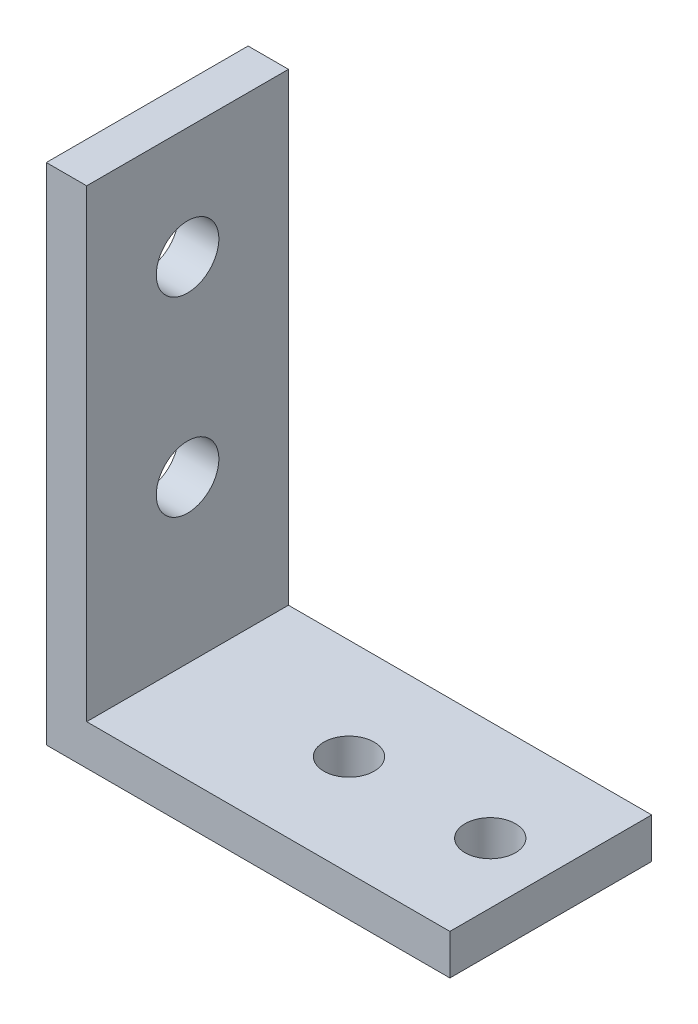
ISO-10303-21;
HEADER;
FILE_DESCRIPTION(('STEP AP214'),'2;1');
FILE_NAME('part.step','',(''),(''),'','','');
FILE_SCHEMA(('AUTOMOTIVE_DESIGN { 1 0 10303 214 1 1 1 1 }'));
ENDSEC;
DATA;
#1=APPLICATION_CONTEXT('core data for automotive mechanical design processes');
#2=APPLICATION_PROTOCOL_DEFINITION('international standard','automotive_design',2000,#1);
#3=PRODUCT_CONTEXT('',#1,'mechanical');
#4=PRODUCT('Part','Part','',(#3));
#5=PRODUCT_RELATED_PRODUCT_CATEGORY('part','',(#4));
#6=PRODUCT_DEFINITION_FORMATION('','',#4);
#7=PRODUCT_DEFINITION_CONTEXT('part definition',#1,'design');
#8=PRODUCT_DEFINITION('design','',#6,#7);
#9=PRODUCT_DEFINITION_SHAPE('','',#8);
#10=(LENGTH_UNIT() NAMED_UNIT(*) SI_UNIT(.MILLI.,.METRE.));
#11=(NAMED_UNIT(*) PLANE_ANGLE_UNIT() SI_UNIT($,.RADIAN.));
#12=(NAMED_UNIT(*) SI_UNIT($,.STERADIAN.) SOLID_ANGLE_UNIT());
#13=UNCERTAINTY_MEASURE_WITH_UNIT(LENGTH_MEASURE(1.E-05),#10,'distance_accuracy_value','');
#14=(GEOMETRIC_REPRESENTATION_CONTEXT(3) GLOBAL_UNCERTAINTY_ASSIGNED_CONTEXT((#13)) GLOBAL_UNIT_ASSIGNED_CONTEXT((#10,
#11,#12)) REPRESENTATION_CONTEXT('',''));
#15=CARTESIAN_POINT('',(0.,0.,0.));
#16=DIRECTION('',(0.,0.,1.));
#17=DIRECTION('',(1.,0.,0.));
#18=AXIS2_PLACEMENT_3D('',#15,#16,#17);
#19=CARTESIAN_POINT('',(20.,0.,5.));
#20=DIRECTION('',(0.,1.,0.));
#21=DIRECTION('',(-1.,0.,0.));
#22=AXIS2_PLACEMENT_3D('',#19,#20,#21);
#23=PLANE('',#22);
#24=CARTESIAN_POINT('',(10.,0.,0.));
#25=DIRECTION('',(0.,-1.,0.));
#26=DIRECTION('',(0.,0.,-1.));
#27=AXIS2_PLACEMENT_3D('',#24,#25,#26);
#28=CIRCLE('',#27,1.24999999999999);
#29=CARTESIAN_POINT('',(10.,0.,-1.24999999999999));
#30=VERTEX_POINT('',#29);
#31=EDGE_CURVE('E167',#30,#30,#28,.T.);
#32=ORIENTED_EDGE('',*,*,#31,.F.);
#33=EDGE_LOOP('',(#32));
#34=FACE_BOUND('',#33,.T.);
#35=CARTESIAN_POINT('',(17.,0.,0.));
#36=DIRECTION('',(0.,-1.,0.));
#37=DIRECTION('',(0.,0.,-1.));
#38=AXIS2_PLACEMENT_3D('',#35,#36,#37);
#39=CIRCLE('',#38,1.24999999999999);
#40=CARTESIAN_POINT('',(17.,0.,-1.24999999999999));
#41=VERTEX_POINT('',#40);
#42=EDGE_CURVE('E170',#41,#41,#39,.T.);
#43=ORIENTED_EDGE('',*,*,#42,.F.);
#44=EDGE_LOOP('',(#43));
#45=FACE_BOUND('',#44,.T.);
#46=DIRECTION('',(1.,0.,0.));
#47=VECTOR('',#46,1.);
#48=CARTESIAN_POINT('',(20.,0.,-5.));
#49=LINE('',#48,#47);
#50=CARTESIAN_POINT('',(0.,0.,-5.));
#51=VERTEX_POINT('',#50);
#52=CARTESIAN_POINT('',(20.,0.,-5.));
#53=VERTEX_POINT('',#52);
#54=EDGE_CURVE('E121',#51,#53,#49,.T.);
#55=ORIENTED_EDGE('',*,*,#54,.T.);
#56=DIRECTION('',(0.,0.,-1.));
#57=VECTOR('',#56,1.);
#58=CARTESIAN_POINT('',(20.,0.,5.));
#59=LINE('',#58,#57);
#60=CARTESIAN_POINT('',(20.,0.,5.));
#61=VERTEX_POINT('',#60);
#62=EDGE_CURVE('E11',#61,#53,#59,.T.);
#63=ORIENTED_EDGE('',*,*,#62,.F.);
#64=DIRECTION('',(1.,0.,0.));
#65=VECTOR('',#64,1.);
#66=CARTESIAN_POINT('',(20.,0.,5.));
#67=LINE('',#66,#65);
#68=CARTESIAN_POINT('',(0.,0.,5.));
#69=VERTEX_POINT('',#68);
#70=EDGE_CURVE('E131',#69,#61,#67,.T.);
#71=ORIENTED_EDGE('',*,*,#70,.F.);
#72=DIRECTION('',(0.,0.,-1.));
#73=VECTOR('',#72,1.);
#74=CARTESIAN_POINT('',(0.,0.,5.));
#75=LINE('',#74,#73);
#76=EDGE_CURVE('E117',#69,#51,#75,.T.);
#77=ORIENTED_EDGE('',*,*,#76,.T.);
#78=EDGE_LOOP('',(#55,#63,#71,#77));
#79=FACE_BOUND('',#78,.T.);
#80=ADVANCED_FACE('F36',(#34,#45,#79),#23,.F.);
#81=CARTESIAN_POINT('',(20.,2.,5.));
#82=DIRECTION('',(-1.,0.,0.));
#83=DIRECTION('',(0.,0.,1.));
#84=AXIS2_PLACEMENT_3D('',#81,#82,#83);
#85=PLANE('',#84);
#86=DIRECTION('',(0.,1.,0.));
#87=VECTOR('',#86,1.);
#88=CARTESIAN_POINT('',(20.,2.,-5.));
#89=LINE('',#88,#87);
#90=CARTESIAN_POINT('',(20.,2.,-5.));
#91=VERTEX_POINT('',#90);
#92=EDGE_CURVE('E124',#53,#91,#89,.T.);
#93=ORIENTED_EDGE('',*,*,#92,.T.);
#94=DIRECTION('',(0.,0.,-1.));
#95=VECTOR('',#94,1.);
#96=CARTESIAN_POINT('',(20.,2.,5.));
#97=LINE('',#96,#95);
#98=CARTESIAN_POINT('',(20.,2.,5.));
#99=VERTEX_POINT('',#98);
#100=EDGE_CURVE('E45',#99,#91,#97,.T.);
#101=ORIENTED_EDGE('',*,*,#100,.F.);
#102=DIRECTION('',(0.,1.,0.));
#103=VECTOR('',#102,1.);
#104=CARTESIAN_POINT('',(20.,2.,5.));
#105=LINE('',#104,#103);
#106=EDGE_CURVE('E90',#61,#99,#105,.T.);
#107=ORIENTED_EDGE('',*,*,#106,.F.);
#108=ORIENTED_EDGE('',*,*,#62,.T.);
#109=EDGE_LOOP('',(#93,#101,#107,#108));
#110=FACE_BOUND('',#109,.T.);
#111=ADVANCED_FACE('F159',(#110),#85,.F.);
#112=CARTESIAN_POINT('',(2.,2.,5.));
#113=DIRECTION('',(0.,-1.,0.));
#114=DIRECTION('',(1.,0.,0.));
#115=AXIS2_PLACEMENT_3D('',#112,#113,#114);
#116=PLANE('',#115);
#117=CARTESIAN_POINT('',(10.,2.,0.));
#118=DIRECTION('',(0.,-1.,0.));
#119=DIRECTION('',(1.,0.,0.));
#120=AXIS2_PLACEMENT_3D('',#117,#118,#119);
#121=CIRCLE('',#120,1.24999999999999);
#122=CARTESIAN_POINT('',(11.25,2.,0.));
#123=VERTEX_POINT('',#122);
#124=EDGE_CURVE('E172',#123,#123,#121,.T.);
#125=ORIENTED_EDGE('',*,*,#124,.T.);
#126=EDGE_LOOP('',(#125));
#127=FACE_BOUND('',#126,.T.);
#128=CARTESIAN_POINT('',(17.,2.,0.));
#129=DIRECTION('',(0.,-1.,0.));
#130=DIRECTION('',(1.,0.,0.));
#131=AXIS2_PLACEMENT_3D('',#128,#129,#130);
#132=CIRCLE('',#131,1.24999999999999);
#133=CARTESIAN_POINT('',(18.25,2.,0.));
#134=VERTEX_POINT('',#133);
#135=EDGE_CURVE('E39',#134,#134,#132,.T.);
#136=ORIENTED_EDGE('',*,*,#135,.T.);
#137=EDGE_LOOP('',(#136));
#138=FACE_BOUND('',#137,.T.);
#139=DIRECTION('',(-1.,0.,0.));
#140=VECTOR('',#139,1.);
#141=CARTESIAN_POINT('',(2.,2.,-5.));
#142=LINE('',#141,#140);
#143=CARTESIAN_POINT('',(2.,2.,-5.));
#144=VERTEX_POINT('',#143);
#145=EDGE_CURVE('E126',#91,#144,#142,.T.);
#146=ORIENTED_EDGE('',*,*,#145,.T.);
#147=DIRECTION('',(0.,0.,-1.));
#148=VECTOR('',#147,1.);
#149=CARTESIAN_POINT('',(2.,2.,5.));
#150=LINE('',#149,#148);
#151=CARTESIAN_POINT('',(2.,2.,5.));
#152=VERTEX_POINT('',#151);
#153=EDGE_CURVE('E112',#152,#144,#150,.T.);
#154=ORIENTED_EDGE('',*,*,#153,.F.);
#155=DIRECTION('',(-1.,0.,0.));
#156=VECTOR('',#155,1.);
#157=CARTESIAN_POINT('',(2.,2.,5.));
#158=LINE('',#157,#156);
#159=EDGE_CURVE('E103',#99,#152,#158,.T.);
#160=ORIENTED_EDGE('',*,*,#159,.F.);
#161=ORIENTED_EDGE('',*,*,#100,.T.);
#162=EDGE_LOOP('',(#146,#154,#160,#161));
#163=FACE_BOUND('',#162,.T.);
#164=ADVANCED_FACE('F138',(#127,#138,#163),#116,.F.);
#165=CARTESIAN_POINT('',(2.,25.,5.));
#166=DIRECTION('',(-1.,0.,0.));
#167=DIRECTION('',(0.,-1.,0.));
#168=AXIS2_PLACEMENT_3D('',#165,#166,#167);
#169=PLANE('',#168);
#170=CARTESIAN_POINT('',(2.,10.,0.));
#171=DIRECTION('',(-1.,0.,0.));
#172=DIRECTION('',(0.,-1.,0.));
#173=AXIS2_PLACEMENT_3D('',#170,#171,#172);
#174=CIRCLE('',#173,1.54999999999999);
#175=CARTESIAN_POINT('',(2.,8.45000000000001,0.));
#176=VERTEX_POINT('',#175);
#177=EDGE_CURVE('E187',#176,#176,#174,.T.);
#178=ORIENTED_EDGE('',*,*,#177,.T.);
#179=EDGE_LOOP('',(#178));
#180=FACE_BOUND('',#179,.T.);
#181=CARTESIAN_POINT('',(2.,19.45,0.));
#182=DIRECTION('',(-1.,0.,0.));
#183=DIRECTION('',(0.,-1.,0.));
#184=AXIS2_PLACEMENT_3D('',#181,#182,#183);
#185=CIRCLE('',#184,1.54999999999999);
#186=CARTESIAN_POINT('',(2.,17.9,0.));
#187=VERTEX_POINT('',#186);
#188=EDGE_CURVE('E181',#187,#187,#185,.T.);
#189=ORIENTED_EDGE('',*,*,#188,.T.);
#190=EDGE_LOOP('',(#189));
#191=FACE_BOUND('',#190,.T.);
#192=DIRECTION('',(0.,1.,0.));
#193=VECTOR('',#192,1.);
#194=CARTESIAN_POINT('',(2.,25.,-5.));
#195=LINE('',#194,#193);
#196=CARTESIAN_POINT('',(2.,25.,-5.));
#197=VERTEX_POINT('',#196);
#198=EDGE_CURVE('E111',#144,#197,#195,.T.);
#199=ORIENTED_EDGE('',*,*,#198,.T.);
#200=DIRECTION('',(0.,0.,-1.));
#201=VECTOR('',#200,1.);
#202=CARTESIAN_POINT('',(2.,25.,5.));
#203=LINE('',#202,#201);
#204=CARTESIAN_POINT('',(2.,25.,5.));
#205=VERTEX_POINT('',#204);
#206=EDGE_CURVE('E108',#205,#197,#203,.T.);
#207=ORIENTED_EDGE('',*,*,#206,.F.);
#208=DIRECTION('',(0.,1.,0.));
#209=VECTOR('',#208,1.);
#210=CARTESIAN_POINT('',(2.,25.,5.));
#211=LINE('',#210,#209);
#212=EDGE_CURVE('E97',#152,#205,#211,.T.);
#213=ORIENTED_EDGE('',*,*,#212,.F.);
#214=ORIENTED_EDGE('',*,*,#153,.T.);
#215=EDGE_LOOP('',(#199,#207,#213,#214));
#216=FACE_BOUND('',#215,.T.);
#217=ADVANCED_FACE('F109',(#180,#191,#216),#169,.F.);
#218=CARTESIAN_POINT('',(0.,25.,5.));
#219=DIRECTION('',(0.,-1.,0.));
#220=DIRECTION('',(0.,0.,-1.));
#221=AXIS2_PLACEMENT_3D('',#218,#219,#220);
#222=PLANE('',#221);
#223=DIRECTION('',(-1.,0.,0.));
#224=VECTOR('',#223,1.);
#225=CARTESIAN_POINT('',(0.,25.,-5.));
#226=LINE('',#225,#224);
#227=CARTESIAN_POINT('',(0.,25.,-5.));
#228=VERTEX_POINT('',#227);
#229=EDGE_CURVE('E76',#197,#228,#226,.T.);
#230=ORIENTED_EDGE('',*,*,#229,.T.);
#231=DIRECTION('',(0.,0.,-1.));
#232=VECTOR('',#231,1.);
#233=CARTESIAN_POINT('',(0.,25.,5.));
#234=LINE('',#233,#232);
#235=CARTESIAN_POINT('',(0.,25.,5.));
#236=VERTEX_POINT('',#235);
#237=EDGE_CURVE('E113',#236,#228,#234,.T.);
#238=ORIENTED_EDGE('',*,*,#237,.F.);
#239=DIRECTION('',(-1.,0.,0.));
#240=VECTOR('',#239,1.);
#241=CARTESIAN_POINT('',(0.,25.,5.));
#242=LINE('',#241,#240);
#243=EDGE_CURVE('E101',#205,#236,#242,.T.);
#244=ORIENTED_EDGE('',*,*,#243,.F.);
#245=ORIENTED_EDGE('',*,*,#206,.T.);
#246=EDGE_LOOP('',(#230,#238,#244,#245));
#247=FACE_BOUND('',#246,.T.);
#248=ADVANCED_FACE('F115',(#247),#222,.F.);
#249=CARTESIAN_POINT('',(0.,0.,5.));
#250=DIRECTION('',(1.,0.,0.));
#251=DIRECTION('',(0.,0.,-1.));
#252=AXIS2_PLACEMENT_3D('',#249,#250,#251);
#253=PLANE('',#252);
#254=CARTESIAN_POINT('',(0.,10.,0.));
#255=DIRECTION('',(-1.,0.,0.));
#256=DIRECTION('',(0.,0.,1.));
#257=AXIS2_PLACEMENT_3D('',#254,#255,#256);
#258=CIRCLE('',#257,1.54999999999999);
#259=CARTESIAN_POINT('',(0.,10.,1.54999999999999));
#260=VERTEX_POINT('',#259);
#261=EDGE_CURVE('E190',#260,#260,#258,.T.);
#262=ORIENTED_EDGE('',*,*,#261,.F.);
#263=EDGE_LOOP('',(#262));
#264=FACE_BOUND('',#263,.T.);
#265=CARTESIAN_POINT('',(0.,19.45,0.));
#266=DIRECTION('',(-1.,0.,0.));
#267=DIRECTION('',(0.,0.,1.));
#268=AXIS2_PLACEMENT_3D('',#265,#266,#267);
#269=CIRCLE('',#268,1.54999999999999);
#270=CARTESIAN_POINT('',(0.,19.45,1.54999999999999));
#271=VERTEX_POINT('',#270);
#272=EDGE_CURVE('E184',#271,#271,#269,.T.);
#273=ORIENTED_EDGE('',*,*,#272,.F.);
#274=EDGE_LOOP('',(#273));
#275=FACE_BOUND('',#274,.T.);
#276=DIRECTION('',(0.,-1.,0.));
#277=VECTOR('',#276,1.);
#278=CARTESIAN_POINT('',(0.,0.,-5.));
#279=LINE('',#278,#277);
#280=EDGE_CURVE('E82',#228,#51,#279,.T.);
#281=ORIENTED_EDGE('',*,*,#280,.T.);
#282=ORIENTED_EDGE('',*,*,#76,.F.);
#283=DIRECTION('',(0.,-1.,0.));
#284=VECTOR('',#283,1.);
#285=CARTESIAN_POINT('',(0.,0.,5.));
#286=LINE('',#285,#284);
#287=EDGE_CURVE('E53',#236,#69,#286,.T.);
#288=ORIENTED_EDGE('',*,*,#287,.F.);
#289=ORIENTED_EDGE('',*,*,#237,.T.);
#290=EDGE_LOOP('',(#281,#282,#288,#289));
#291=FACE_BOUND('',#290,.T.);
#292=ADVANCED_FACE('F145',(#264,#275,#291),#253,.F.);
#293=CARTESIAN_POINT('',(0.,0.,5.));
#294=DIRECTION('',(0.,0.,-1.));
#295=DIRECTION('',(-1.,0.,0.));
#296=AXIS2_PLACEMENT_3D('',#293,#294,#295);
#297=PLANE('',#296);
#298=ORIENTED_EDGE('',*,*,#70,.T.);
#299=ORIENTED_EDGE('',*,*,#106,.T.);
#300=ORIENTED_EDGE('',*,*,#159,.T.);
#301=ORIENTED_EDGE('',*,*,#212,.T.);
#302=ORIENTED_EDGE('',*,*,#243,.T.);
#303=ORIENTED_EDGE('',*,*,#287,.T.);
#304=EDGE_LOOP('',(#298,#299,#300,#301,#302,#303));
#305=FACE_BOUND('',#304,.T.);
#306=ADVANCED_FACE('F99',(#305),#297,.F.);
#307=CARTESIAN_POINT('',(0.,0.,-5.));
#308=DIRECTION('',(0.,0.,-1.));
#309=DIRECTION('',(-1.,0.,0.));
#310=AXIS2_PLACEMENT_3D('',#307,#308,#309);
#311=PLANE('',#310);
#312=ORIENTED_EDGE('',*,*,#54,.F.);
#313=ORIENTED_EDGE('',*,*,#280,.F.);
#314=ORIENTED_EDGE('',*,*,#229,.F.);
#315=ORIENTED_EDGE('',*,*,#198,.F.);
#316=ORIENTED_EDGE('',*,*,#145,.F.);
#317=ORIENTED_EDGE('',*,*,#92,.F.);
#318=EDGE_LOOP('',(#312,#313,#314,#315,#316,#317));
#319=FACE_BOUND('',#318,.T.);
#320=ADVANCED_FACE('F141',(#319),#311,.T.);
#321=CARTESIAN_POINT('',(17.,0.,0.));
#322=DIRECTION('',(0.,-1.,0.));
#323=DIRECTION('',(0.,0.,-1.));
#324=AXIS2_PLACEMENT_3D('',#321,#322,#323);
#325=CYLINDRICAL_SURFACE('',#324,1.24999999999999);
#326=ORIENTED_EDGE('',*,*,#42,.T.);
#327=EDGE_LOOP('',(#326));
#328=FACE_BOUND('',#327,.T.);
#329=ORIENTED_EDGE('',*,*,#135,.F.);
#330=EDGE_LOOP('',(#329));
#331=FACE_BOUND('',#330,.T.);
#332=ADVANCED_FACE('F212',(#328,#331),#325,.F.);
#333=CARTESIAN_POINT('',(10.,0.,0.));
#334=DIRECTION('',(0.,-1.,0.));
#335=DIRECTION('',(0.,0.,-1.));
#336=AXIS2_PLACEMENT_3D('',#333,#334,#335);
#337=CYLINDRICAL_SURFACE('',#336,1.24999999999999);
#338=ORIENTED_EDGE('',*,*,#31,.T.);
#339=EDGE_LOOP('',(#338));
#340=FACE_BOUND('',#339,.T.);
#341=ORIENTED_EDGE('',*,*,#124,.F.);
#342=EDGE_LOOP('',(#341));
#343=FACE_BOUND('',#342,.T.);
#344=ADVANCED_FACE('F206',(#340,#343),#337,.F.);
#345=CARTESIAN_POINT('',(0.,19.45,0.));
#346=DIRECTION('',(-1.,0.,0.));
#347=DIRECTION('',(0.,0.,1.));
#348=AXIS2_PLACEMENT_3D('',#345,#346,#347);
#349=CYLINDRICAL_SURFACE('',#348,1.54999999999999);
#350=ORIENTED_EDGE('',*,*,#272,.T.);
#351=EDGE_LOOP('',(#350));
#352=FACE_BOUND('',#351,.T.);
#353=ORIENTED_EDGE('',*,*,#188,.F.);
#354=EDGE_LOOP('',(#353));
#355=FACE_BOUND('',#354,.T.);
#356=ADVANCED_FACE('F196',(#352,#355),#349,.F.);
#357=CARTESIAN_POINT('',(0.,10.,0.));
#358=DIRECTION('',(-1.,0.,0.));
#359=DIRECTION('',(0.,0.,1.));
#360=AXIS2_PLACEMENT_3D('',#357,#358,#359);
#361=CYLINDRICAL_SURFACE('',#360,1.54999999999999);
#362=ORIENTED_EDGE('',*,*,#261,.T.);
#363=EDGE_LOOP('',(#362));
#364=FACE_BOUND('',#363,.T.);
#365=ORIENTED_EDGE('',*,*,#177,.F.);
#366=EDGE_LOOP('',(#365));
#367=FACE_BOUND('',#366,.T.);
#368=ADVANCED_FACE('F193',(#364,#367),#361,.F.);
#369=CLOSED_SHELL('',(#80,#111,#164,#217,#248,#292,#306,#320,#332,#344,#356,#368));
#370=MANIFOLD_SOLID_BREP('B2',#369);
#371=ADVANCED_BREP_SHAPE_REPRESENTATION('',(#18,#370),#14);
#372=SHAPE_DEFINITION_REPRESENTATION(#9,#371);
ENDSEC;
END-ISO-10303-21;
